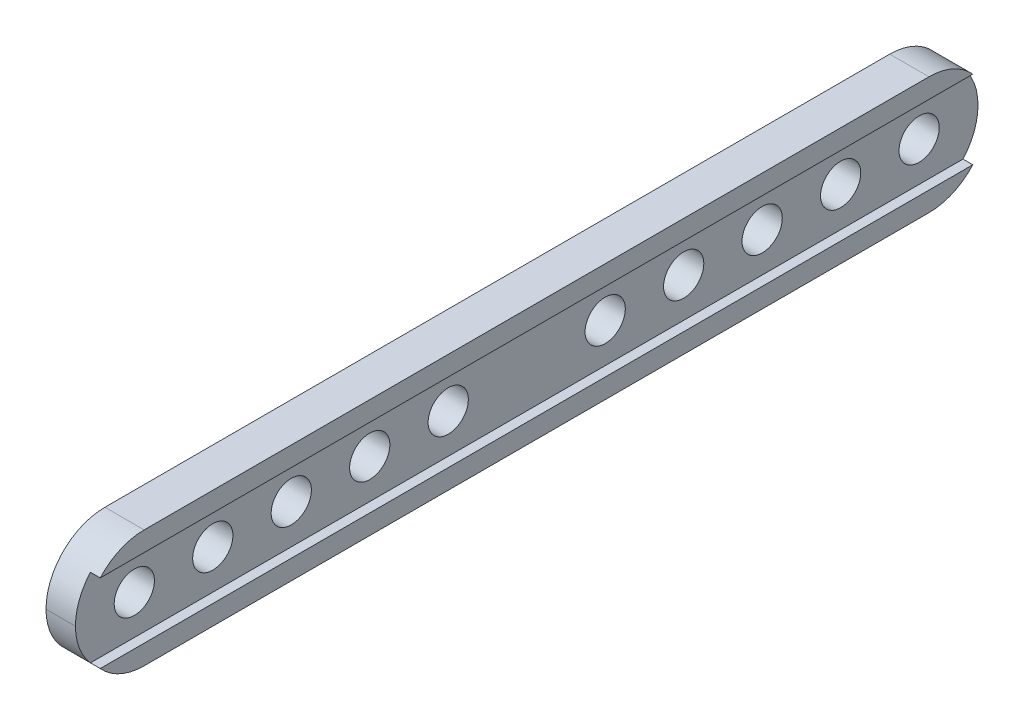
ISO-10303-21;
HEADER;
FILE_DESCRIPTION(('STEP AP214'),'2;1');
FILE_NAME('part.step','',(''),(''),'','','');
FILE_SCHEMA(('AUTOMOTIVE_DESIGN { 1 0 10303 214 1 1 1 1 }'));
ENDSEC;
DATA;
#1=APPLICATION_CONTEXT('core data for automotive mechanical design processes');
#2=APPLICATION_PROTOCOL_DEFINITION('international standard','automotive_design',2000,#1);
#3=PRODUCT_CONTEXT('',#1,'mechanical');
#4=PRODUCT('Part','Part','',(#3));
#5=PRODUCT_RELATED_PRODUCT_CATEGORY('part','',(#4));
#6=PRODUCT_DEFINITION_FORMATION('','',#4);
#7=PRODUCT_DEFINITION_CONTEXT('part definition',#1,'design');
#8=PRODUCT_DEFINITION('design','',#6,#7);
#9=PRODUCT_DEFINITION_SHAPE('','',#8);
#10=(LENGTH_UNIT() NAMED_UNIT(*) SI_UNIT(.MILLI.,.METRE.));
#11=(NAMED_UNIT(*) PLANE_ANGLE_UNIT() SI_UNIT($,.RADIAN.));
#12=(NAMED_UNIT(*) SI_UNIT($,.STERADIAN.) SOLID_ANGLE_UNIT());
#13=UNCERTAINTY_MEASURE_WITH_UNIT(LENGTH_MEASURE(1.E-05),#10,'distance_accuracy_value','');
#14=(GEOMETRIC_REPRESENTATION_CONTEXT(3) GLOBAL_UNCERTAINTY_ASSIGNED_CONTEXT((#13)) GLOBAL_UNIT_ASSIGNED_CONTEXT((#10,
#11,#12)) REPRESENTATION_CONTEXT('',''));
#15=CARTESIAN_POINT('',(0.,0.,0.));
#16=DIRECTION('',(0.,0.,1.));
#17=DIRECTION('',(1.,0.,0.));
#18=AXIS2_PLACEMENT_3D('',#15,#16,#17);
#19=CARTESIAN_POINT('',(4.,6.,-54.));
#20=DIRECTION('',(-1.,0.,0.));
#21=DIRECTION('',(0.,-1.,0.));
#22=AXIS2_PLACEMENT_3D('',#19,#20,#21);
#23=CYLINDRICAL_SURFACE('',#22,2.04999999999999);
#24=CARTESIAN_POINT('',(3.,6.,-54.));
#25=DIRECTION('',(1.,0.,0.));
#26=DIRECTION('',(0.,1.,0.));
#27=AXIS2_PLACEMENT_3D('',#24,#25,#26);
#28=CIRCLE('',#27,2.04999999999999);
#29=CARTESIAN_POINT('',(3.,8.04999999999999,-54.));
#30=VERTEX_POINT('',#29);
#31=EDGE_CURVE('E41',#30,#30,#28,.T.);
#32=ORIENTED_EDGE('',*,*,#31,.T.);
#33=EDGE_LOOP('',(#32));
#34=FACE_BOUND('',#33,.T.);
#35=CARTESIAN_POINT('',(0.,6.,-54.));
#36=DIRECTION('',(-1.,0.,0.));
#37=DIRECTION('',(0.,-1.,0.));
#38=AXIS2_PLACEMENT_3D('',#35,#36,#37);
#39=CIRCLE('',#38,2.04999999999999);
#40=CARTESIAN_POINT('',(0.,3.95000000000001,-54.));
#41=VERTEX_POINT('',#40);
#42=EDGE_CURVE('E11',#41,#41,#39,.T.);
#43=ORIENTED_EDGE('',*,*,#42,.T.);
#44=EDGE_LOOP('',(#43));
#45=FACE_BOUND('',#44,.T.);
#46=ADVANCED_FACE('F33',(#34,#45),#23,.F.);
#47=CARTESIAN_POINT('',(4.,6.,-62.));
#48=DIRECTION('',(-1.,0.,0.));
#49=DIRECTION('',(0.,-1.,0.));
#50=AXIS2_PLACEMENT_3D('',#47,#48,#49);
#51=CYLINDRICAL_SURFACE('',#50,2.04999999999999);
#52=CARTESIAN_POINT('',(3.,6.,-62.));
#53=DIRECTION('',(1.,0.,0.));
#54=DIRECTION('',(0.,1.,0.));
#55=AXIS2_PLACEMENT_3D('',#52,#53,#54);
#56=CIRCLE('',#55,2.04999999999999);
#57=CARTESIAN_POINT('',(3.,8.04999999999999,-62.));
#58=VERTEX_POINT('',#57);
#59=EDGE_CURVE('E185',#58,#58,#56,.T.);
#60=ORIENTED_EDGE('',*,*,#59,.T.);
#61=EDGE_LOOP('',(#60));
#62=FACE_BOUND('',#61,.T.);
#63=CARTESIAN_POINT('',(0.,6.,-62.));
#64=DIRECTION('',(-1.,0.,0.));
#65=DIRECTION('',(0.,-1.,0.));
#66=AXIS2_PLACEMENT_3D('',#63,#64,#65);
#67=CIRCLE('',#66,2.04999999999999);
#68=CARTESIAN_POINT('',(0.,3.95000000000001,-62.));
#69=VERTEX_POINT('',#68);
#70=EDGE_CURVE('E188',#69,#69,#67,.T.);
#71=ORIENTED_EDGE('',*,*,#70,.T.);
#72=EDGE_LOOP('',(#71));
#73=FACE_BOUND('',#72,.T.);
#74=ADVANCED_FACE('F270',(#62,#73),#51,.F.);
#75=CARTESIAN_POINT('',(4.,6.,-70.));
#76=DIRECTION('',(-1.,0.,0.));
#77=DIRECTION('',(0.,-1.,0.));
#78=AXIS2_PLACEMENT_3D('',#75,#76,#77);
#79=CYLINDRICAL_SURFACE('',#78,2.04999999999999);
#80=CARTESIAN_POINT('',(3.,6.,-70.));
#81=DIRECTION('',(1.,0.,0.));
#82=DIRECTION('',(0.,1.,0.));
#83=AXIS2_PLACEMENT_3D('',#80,#81,#82);
#84=CIRCLE('',#83,2.04999999999999);
#85=CARTESIAN_POINT('',(3.,8.04999999999999,-70.));
#86=VERTEX_POINT('',#85);
#87=EDGE_CURVE('E172',#86,#86,#84,.T.);
#88=ORIENTED_EDGE('',*,*,#87,.T.);
#89=EDGE_LOOP('',(#88));
#90=FACE_BOUND('',#89,.T.);
#91=CARTESIAN_POINT('',(0.,6.,-70.));
#92=DIRECTION('',(-1.,0.,0.));
#93=DIRECTION('',(0.,-1.,0.));
#94=AXIS2_PLACEMENT_3D('',#91,#92,#93);
#95=CIRCLE('',#94,2.04999999999999);
#96=CARTESIAN_POINT('',(0.,3.95000000000001,-70.));
#97=VERTEX_POINT('',#96);
#98=EDGE_CURVE('E182',#97,#97,#95,.T.);
#99=ORIENTED_EDGE('',*,*,#98,.T.);
#100=EDGE_LOOP('',(#99));
#101=FACE_BOUND('',#100,.T.);
#102=ADVANCED_FACE('F275',(#90,#101),#79,.F.);
#103=CARTESIAN_POINT('',(0.,0.,-92.));
#104=DIRECTION('',(-1.,0.,0.));
#105=DIRECTION('',(0.,-1.,0.));
#106=AXIS2_PLACEMENT_3D('',#103,#104,#105);
#107=PLANE('',#106);
#108=CARTESIAN_POINT('',(0.,6.,-22.));
#109=DIRECTION('',(1.,0.,0.));
#110=DIRECTION('',(0.,-1.,0.));
#111=AXIS2_PLACEMENT_3D('',#108,#109,#110);
#112=CIRCLE('',#111,2.04999999999999);
#113=CARTESIAN_POINT('',(0.,3.95000000000001,-22.));
#114=VERTEX_POINT('',#113);
#115=EDGE_CURVE('E205',#114,#114,#112,.T.);
#116=ORIENTED_EDGE('',*,*,#115,.T.);
#117=EDGE_LOOP('',(#116));
#118=FACE_BOUND('',#117,.T.);
#119=CARTESIAN_POINT('',(0.,6.,-30.));
#120=DIRECTION('',(1.,0.,0.));
#121=DIRECTION('',(0.,-1.,0.));
#122=AXIS2_PLACEMENT_3D('',#119,#120,#121);
#123=CIRCLE('',#122,2.04999999999999);
#124=CARTESIAN_POINT('',(0.,3.95000000000001,-30.));
#125=VERTEX_POINT('',#124);
#126=EDGE_CURVE('E351',#125,#125,#123,.T.);
#127=ORIENTED_EDGE('',*,*,#126,.T.);
#128=EDGE_LOOP('',(#127));
#129=FACE_BOUND('',#128,.T.);
#130=CARTESIAN_POINT('',(0.,6.,-38.));
#131=DIRECTION('',(1.,0.,0.));
#132=DIRECTION('',(0.,-1.,0.));
#133=AXIS2_PLACEMENT_3D('',#130,#131,#132);
#134=CIRCLE('',#133,2.04999999999999);
#135=CARTESIAN_POINT('',(0.,3.95000000000001,-38.));
#136=VERTEX_POINT('',#135);
#137=EDGE_CURVE('E218',#136,#136,#134,.T.);
#138=ORIENTED_EDGE('',*,*,#137,.T.);
#139=EDGE_LOOP('',(#138));
#140=FACE_BOUND('',#139,.T.);
#141=CARTESIAN_POINT('',(0.,6.,-14.));
#142=DIRECTION('',(1.,0.,0.));
#143=DIRECTION('',(0.,-1.,0.));
#144=AXIS2_PLACEMENT_3D('',#141,#142,#143);
#145=CIRCLE('',#144,2.04999999999999);
#146=CARTESIAN_POINT('',(0.,3.95000000000001,-14.));
#147=VERTEX_POINT('',#146);
#148=EDGE_CURVE('E201',#147,#147,#145,.T.);
#149=ORIENTED_EDGE('',*,*,#148,.T.);
#150=EDGE_LOOP('',(#149));
#151=FACE_BOUND('',#150,.T.);
#152=CARTESIAN_POINT('',(0.,6.,-6.00000000000001));
#153=DIRECTION('',(1.,0.,0.));
#154=DIRECTION('',(0.,-1.,0.));
#155=AXIS2_PLACEMENT_3D('',#152,#153,#154);
#156=CIRCLE('',#155,2.04999999999999);
#157=CARTESIAN_POINT('',(0.,3.95000000000001,-6.00000000000001));
#158=VERTEX_POINT('',#157);
#159=EDGE_CURVE('E197',#158,#158,#156,.T.);
#160=ORIENTED_EDGE('',*,*,#159,.T.);
#161=EDGE_LOOP('',(#160));
#162=FACE_BOUND('',#161,.T.);
#163=CARTESIAN_POINT('',(0.,6.,-78.));
#164=DIRECTION('',(-1.,0.,0.));
#165=DIRECTION('',(0.,-1.,0.));
#166=AXIS2_PLACEMENT_3D('',#163,#164,#165);
#167=CIRCLE('',#166,2.04999999999999);
#168=CARTESIAN_POINT('',(0.,3.95000000000001,-78.));
#169=VERTEX_POINT('',#168);
#170=EDGE_CURVE('E224',#169,#169,#167,.T.);
#171=ORIENTED_EDGE('',*,*,#170,.F.);
#172=EDGE_LOOP('',(#171));
#173=FACE_BOUND('',#172,.T.);
#174=CARTESIAN_POINT('',(0.,6.,-86.));
#175=DIRECTION('',(-1.,0.,0.));
#176=DIRECTION('',(0.,-1.,0.));
#177=AXIS2_PLACEMENT_3D('',#174,#175,#176);
#178=CIRCLE('',#177,2.04999999999999);
#179=CARTESIAN_POINT('',(0.,3.95000000000001,-86.));
#180=VERTEX_POINT('',#179);
#181=EDGE_CURVE('E179',#180,#180,#178,.T.);
#182=ORIENTED_EDGE('',*,*,#181,.F.);
#183=EDGE_LOOP('',(#182));
#184=FACE_BOUND('',#183,.T.);
#185=CARTESIAN_POINT('',(0.,6.,-6.));
#186=DIRECTION('',(-1.,0.,0.));
#187=DIRECTION('',(0.,-1.,0.));
#188=AXIS2_PLACEMENT_3D('',#185,#186,#187);
#189=CIRCLE('',#188,6.);
#190=CARTESIAN_POINT('',(0.,0.,-6.00000000000001));
#191=VERTEX_POINT('',#190);
#192=CARTESIAN_POINT('',(0.,6.,0.));
#193=VERTEX_POINT('',#192);
#194=EDGE_CURVE('E114',#191,#193,#189,.T.);
#195=ORIENTED_EDGE('',*,*,#194,.T.);
#196=CARTESIAN_POINT('',(0.,6.,-6.));
#197=DIRECTION('',(-1.,0.,0.));
#198=DIRECTION('',(0.,-1.,0.));
#199=AXIS2_PLACEMENT_3D('',#196,#197,#198);
#200=CIRCLE('',#199,6.);
#201=CARTESIAN_POINT('',(0.,12.,-6.00000000000001));
#202=VERTEX_POINT('',#201);
#203=EDGE_CURVE('E120',#193,#202,#200,.T.);
#204=ORIENTED_EDGE('',*,*,#203,.T.);
#205=DIRECTION('',(0.,0.,1.));
#206=VECTOR('',#205,1.);
#207=CARTESIAN_POINT('',(0.,12.,-92.));
#208=LINE('',#207,#206);
#209=CARTESIAN_POINT('',(0.,12.,-86.));
#210=VERTEX_POINT('',#209);
#211=EDGE_CURVE('E229',#210,#202,#208,.T.);
#212=ORIENTED_EDGE('',*,*,#211,.F.);
#213=CARTESIAN_POINT('',(0.,6.,-86.));
#214=DIRECTION('',(-1.,0.,0.));
#215=DIRECTION('',(0.,-1.,0.));
#216=AXIS2_PLACEMENT_3D('',#213,#214,#215);
#217=CIRCLE('',#216,6.);
#218=CARTESIAN_POINT('',(0.,6.,-92.));
#219=VERTEX_POINT('',#218);
#220=EDGE_CURVE('E231',#210,#219,#217,.T.);
#221=ORIENTED_EDGE('',*,*,#220,.T.);
#222=CARTESIAN_POINT('',(0.,6.,-86.));
#223=DIRECTION('',(-1.,0.,0.));
#224=DIRECTION('',(0.,-1.,0.));
#225=AXIS2_PLACEMENT_3D('',#222,#223,#224);
#226=CIRCLE('',#225,6.);
#227=CARTESIAN_POINT('',(0.,0.,-86.));
#228=VERTEX_POINT('',#227);
#229=EDGE_CURVE('E126',#219,#228,#226,.T.);
#230=ORIENTED_EDGE('',*,*,#229,.T.);
#231=DIRECTION('',(0.,0.,1.));
#232=VECTOR('',#231,1.);
#233=CARTESIAN_POINT('',(0.,0.,-92.));
#234=LINE('',#233,#232);
#235=EDGE_CURVE('E123',#228,#191,#234,.T.);
#236=ORIENTED_EDGE('',*,*,#235,.T.);
#237=EDGE_LOOP('',(#195,#204,#212,#221,#230,#236));
#238=FACE_BOUND('',#237,.T.);
#239=ORIENTED_EDGE('',*,*,#98,.F.);
#240=EDGE_LOOP('',(#239));
#241=FACE_BOUND('',#240,.T.);
#242=ORIENTED_EDGE('',*,*,#70,.F.);
#243=EDGE_LOOP('',(#242));
#244=FACE_BOUND('',#243,.T.);
#245=ORIENTED_EDGE('',*,*,#42,.F.);
#246=EDGE_LOOP('',(#245));
#247=FACE_BOUND('',#246,.T.);
#248=ADVANCED_FACE('F116',(#118,#129,#140,#151,#162,#173,#184,#238,#241,#244,#247),#107,.T.);
#249=CARTESIAN_POINT('',(0.,12.,-92.));
#250=DIRECTION('',(0.,1.,0.));
#251=DIRECTION('',(0.,0.,1.));
#252=AXIS2_PLACEMENT_3D('',#249,#250,#251);
#253=PLANE('',#252);
#254=ORIENTED_EDGE('',*,*,#211,.T.);
#255=DIRECTION('',(-1.,0.,0.));
#256=VECTOR('',#255,1.);
#257=CARTESIAN_POINT('',(4.,12.,-6.));
#258=LINE('',#257,#256);
#259=CARTESIAN_POINT('',(4.,12.,-6.00000000000001));
#260=VERTEX_POINT('',#259);
#261=EDGE_CURVE('E141',#202,#260,#258,.F.);
#262=ORIENTED_EDGE('',*,*,#261,.T.);
#263=DIRECTION('',(0.,0.,1.));
#264=VECTOR('',#263,1.);
#265=CARTESIAN_POINT('',(4.,12.,-92.));
#266=LINE('',#265,#264);
#267=CARTESIAN_POINT('',(4.,12.,-86.));
#268=VERTEX_POINT('',#267);
#269=EDGE_CURVE('E232',#268,#260,#266,.T.);
#270=ORIENTED_EDGE('',*,*,#269,.F.);
#271=DIRECTION('',(-1.,0.,0.));
#272=VECTOR('',#271,1.);
#273=CARTESIAN_POINT('',(0.,12.,-86.));
#274=LINE('',#273,#272);
#275=EDGE_CURVE('E142',#268,#210,#274,.T.);
#276=ORIENTED_EDGE('',*,*,#275,.T.);
#277=EDGE_LOOP('',(#254,#262,#270,#276));
#278=FACE_BOUND('',#277,.T.);
#279=ADVANCED_FACE('F282',(#278),#253,.T.);
#280=CARTESIAN_POINT('',(4.,10.,-92.));
#281=DIRECTION('',(1.,0.,0.));
#282=DIRECTION('',(0.,1.,0.));
#283=AXIS2_PLACEMENT_3D('',#280,#281,#282);
#284=PLANE('',#283);
#285=ORIENTED_EDGE('',*,*,#269,.T.);
#286=CARTESIAN_POINT('',(4.,6.,-6.));
#287=DIRECTION('',(1.,0.,0.));
#288=DIRECTION('',(0.,1.,0.));
#289=AXIS2_PLACEMENT_3D('',#286,#287,#288);
#290=CIRCLE('',#289,6.);
#291=CARTESIAN_POINT('',(4.,10.,-1.52786404500042));
#292=VERTEX_POINT('',#291);
#293=EDGE_CURVE('E150',#260,#292,#290,.T.);
#294=ORIENTED_EDGE('',*,*,#293,.T.);
#295=DIRECTION('',(0.,0.,1.));
#296=VECTOR('',#295,1.);
#297=CARTESIAN_POINT('',(4.,10.,-92.));
#298=LINE('',#297,#296);
#299=CARTESIAN_POINT('',(4.,10.,-90.4721359549996));
#300=VERTEX_POINT('',#299);
#301=EDGE_CURVE('E235',#300,#292,#298,.T.);
#302=ORIENTED_EDGE('',*,*,#301,.F.);
#303=CARTESIAN_POINT('',(4.,6.,-86.));
#304=DIRECTION('',(1.,0.,0.));
#305=DIRECTION('',(0.,1.,0.));
#306=AXIS2_PLACEMENT_3D('',#303,#304,#305);
#307=CIRCLE('',#306,6.);
#308=EDGE_CURVE('E148',#300,#268,#307,.T.);
#309=ORIENTED_EDGE('',*,*,#308,.T.);
#310=EDGE_LOOP('',(#285,#294,#302,#309));
#311=FACE_BOUND('',#310,.T.);
#312=ADVANCED_FACE('F289',(#311),#284,.T.);
#313=CARTESIAN_POINT('',(4.,10.,-92.));
#314=DIRECTION('',(0.,-1.,0.));
#315=DIRECTION('',(1.,0.,0.));
#316=AXIS2_PLACEMENT_3D('',#313,#314,#315);
#317=PLANE('',#316);
#318=ORIENTED_EDGE('',*,*,#301,.T.);
#319=DIRECTION('',(1.,0.,0.));
#320=VECTOR('',#319,1.);
#321=CARTESIAN_POINT('',(4.,10.,-1.52786404500043));
#322=LINE('',#321,#320);
#323=CARTESIAN_POINT('',(3.,10.,-1.52786404500042));
#324=VERTEX_POINT('',#323);
#325=EDGE_CURVE('E154',#292,#324,#322,.F.);
#326=ORIENTED_EDGE('',*,*,#325,.T.);
#327=DIRECTION('',(0.,0.,1.));
#328=VECTOR('',#327,1.);
#329=CARTESIAN_POINT('',(3.,10.,-92.));
#330=LINE('',#329,#328);
#331=CARTESIAN_POINT('',(3.,10.,-90.4721359549996));
#332=VERTEX_POINT('',#331);
#333=EDGE_CURVE('E238',#332,#324,#330,.T.);
#334=ORIENTED_EDGE('',*,*,#333,.F.);
#335=DIRECTION('',(-1.,0.,0.));
#336=VECTOR('',#335,1.);
#337=CARTESIAN_POINT('',(3.,10.,-90.4721359549996));
#338=LINE('',#337,#336);
#339=EDGE_CURVE('E152',#332,#300,#338,.F.);
#340=ORIENTED_EDGE('',*,*,#339,.T.);
#341=EDGE_LOOP('',(#318,#326,#334,#340));
#342=FACE_BOUND('',#341,.T.);
#343=ADVANCED_FACE('F318',(#342),#317,.T.);
#344=CARTESIAN_POINT('',(3.,10.,-92.));
#345=DIRECTION('',(1.,0.,0.));
#346=DIRECTION('',(0.,1.,0.));
#347=AXIS2_PLACEMENT_3D('',#344,#345,#346);
#348=PLANE('',#347);
#349=CARTESIAN_POINT('',(3.,6.,-22.));
#350=DIRECTION('',(1.,0.,0.));
#351=DIRECTION('',(0.,1.,0.));
#352=AXIS2_PLACEMENT_3D('',#349,#350,#351);
#353=CIRCLE('',#352,2.04999999999999);
#354=CARTESIAN_POINT('',(3.,8.04999999999999,-22.));
#355=VERTEX_POINT('',#354);
#356=EDGE_CURVE('E36',#355,#355,#353,.F.);
#357=ORIENTED_EDGE('',*,*,#356,.T.);
#358=EDGE_LOOP('',(#357));
#359=FACE_BOUND('',#358,.T.);
#360=CARTESIAN_POINT('',(3.,6.,-30.));
#361=DIRECTION('',(1.,0.,0.));
#362=DIRECTION('',(0.,1.,0.));
#363=AXIS2_PLACEMENT_3D('',#360,#361,#362);
#364=CIRCLE('',#363,2.04999999999999);
#365=CARTESIAN_POINT('',(3.,8.04999999999999,-30.));
#366=VERTEX_POINT('',#365);
#367=EDGE_CURVE('E204',#366,#366,#364,.F.);
#368=ORIENTED_EDGE('',*,*,#367,.T.);
#369=EDGE_LOOP('',(#368));
#370=FACE_BOUND('',#369,.T.);
#371=CARTESIAN_POINT('',(3.,6.,-38.));
#372=DIRECTION('',(1.,0.,0.));
#373=DIRECTION('',(0.,1.,0.));
#374=AXIS2_PLACEMENT_3D('',#371,#372,#373);
#375=CIRCLE('',#374,2.04999999999999);
#376=CARTESIAN_POINT('',(3.,8.04999999999999,-38.));
#377=VERTEX_POINT('',#376);
#378=EDGE_CURVE('E202',#377,#377,#375,.F.);
#379=ORIENTED_EDGE('',*,*,#378,.T.);
#380=EDGE_LOOP('',(#379));
#381=FACE_BOUND('',#380,.T.);
#382=CARTESIAN_POINT('',(3.,6.,-14.));
#383=DIRECTION('',(1.,0.,0.));
#384=DIRECTION('',(0.,1.,0.));
#385=AXIS2_PLACEMENT_3D('',#382,#383,#384);
#386=CIRCLE('',#385,2.04999999999999);
#387=CARTESIAN_POINT('',(3.,8.04999999999999,-14.));
#388=VERTEX_POINT('',#387);
#389=EDGE_CURVE('E198',#388,#388,#386,.F.);
#390=ORIENTED_EDGE('',*,*,#389,.T.);
#391=EDGE_LOOP('',(#390));
#392=FACE_BOUND('',#391,.T.);
#393=CARTESIAN_POINT('',(3.,6.,-6.00000000000001));
#394=DIRECTION('',(1.,0.,0.));
#395=DIRECTION('',(0.,1.,0.));
#396=AXIS2_PLACEMENT_3D('',#393,#394,#395);
#397=CIRCLE('',#396,2.04999999999999);
#398=CARTESIAN_POINT('',(3.,8.04999999999999,-6.00000000000001));
#399=VERTEX_POINT('',#398);
#400=EDGE_CURVE('E193',#399,#399,#397,.F.);
#401=ORIENTED_EDGE('',*,*,#400,.T.);
#402=EDGE_LOOP('',(#401));
#403=FACE_BOUND('',#402,.T.);
#404=CARTESIAN_POINT('',(3.,6.,-78.));
#405=DIRECTION('',(1.,0.,0.));
#406=DIRECTION('',(0.,1.,0.));
#407=AXIS2_PLACEMENT_3D('',#404,#405,#406);
#408=CIRCLE('',#407,2.04999999999999);
#409=CARTESIAN_POINT('',(3.,8.04999999999999,-78.));
#410=VERTEX_POINT('',#409);
#411=EDGE_CURVE('E196',#410,#410,#408,.T.);
#412=ORIENTED_EDGE('',*,*,#411,.F.);
#413=EDGE_LOOP('',(#412));
#414=FACE_BOUND('',#413,.T.);
#415=CARTESIAN_POINT('',(3.,6.,-86.));
#416=DIRECTION('',(1.,0.,0.));
#417=DIRECTION('',(0.,1.,0.));
#418=AXIS2_PLACEMENT_3D('',#415,#416,#417);
#419=CIRCLE('',#418,2.04999999999999);
#420=CARTESIAN_POINT('',(3.,8.04999999999999,-86.));
#421=VERTEX_POINT('',#420);
#422=EDGE_CURVE('E176',#421,#421,#419,.T.);
#423=ORIENTED_EDGE('',*,*,#422,.F.);
#424=EDGE_LOOP('',(#423));
#425=FACE_BOUND('',#424,.T.);
#426=ORIENTED_EDGE('',*,*,#333,.T.);
#427=CARTESIAN_POINT('',(3.,6.,-6.));
#428=DIRECTION('',(1.,0.,0.));
#429=DIRECTION('',(0.,1.,0.));
#430=AXIS2_PLACEMENT_3D('',#427,#428,#429);
#431=CIRCLE('',#430,6.);
#432=CARTESIAN_POINT('',(3.,6.,0.));
#433=VERTEX_POINT('',#432);
#434=EDGE_CURVE('E161',#324,#433,#431,.T.);
#435=ORIENTED_EDGE('',*,*,#434,.T.);
#436=CARTESIAN_POINT('',(3.,6.,-6.));
#437=DIRECTION('',(1.,0.,0.));
#438=DIRECTION('',(0.,1.,0.));
#439=AXIS2_PLACEMENT_3D('',#436,#437,#438);
#440=CIRCLE('',#439,6.);
#441=CARTESIAN_POINT('',(3.,2.,-1.52786404500042));
#442=VERTEX_POINT('',#441);
#443=EDGE_CURVE('E133',#433,#442,#440,.T.);
#444=ORIENTED_EDGE('',*,*,#443,.T.);
#445=DIRECTION('',(0.,0.,1.));
#446=VECTOR('',#445,1.);
#447=CARTESIAN_POINT('',(3.,2.,-92.));
#448=LINE('',#447,#446);
#449=CARTESIAN_POINT('',(3.,2.,-90.4721359549996));
#450=VERTEX_POINT('',#449);
#451=EDGE_CURVE('E241',#450,#442,#448,.T.);
#452=ORIENTED_EDGE('',*,*,#451,.F.);
#453=CARTESIAN_POINT('',(3.,6.,-86.));
#454=DIRECTION('',(1.,0.,0.));
#455=DIRECTION('',(0.,1.,0.));
#456=AXIS2_PLACEMENT_3D('',#453,#454,#455);
#457=CIRCLE('',#456,6.);
#458=CARTESIAN_POINT('',(3.,6.,-92.));
#459=VERTEX_POINT('',#458);
#460=EDGE_CURVE('E158',#450,#459,#457,.T.);
#461=ORIENTED_EDGE('',*,*,#460,.T.);
#462=CARTESIAN_POINT('',(3.,6.,-86.));
#463=DIRECTION('',(1.,0.,0.));
#464=DIRECTION('',(0.,1.,0.));
#465=AXIS2_PLACEMENT_3D('',#462,#463,#464);
#466=CIRCLE('',#465,6.);
#467=EDGE_CURVE('E156',#459,#332,#466,.T.);
#468=ORIENTED_EDGE('',*,*,#467,.T.);
#469=EDGE_LOOP('',(#426,#435,#444,#452,#461,#468));
#470=FACE_BOUND('',#469,.T.);
#471=ORIENTED_EDGE('',*,*,#87,.F.);
#472=EDGE_LOOP('',(#471));
#473=FACE_BOUND('',#472,.T.);
#474=ORIENTED_EDGE('',*,*,#59,.F.);
#475=EDGE_LOOP('',(#474));
#476=FACE_BOUND('',#475,.T.);
#477=ORIENTED_EDGE('',*,*,#31,.F.);
#478=EDGE_LOOP('',(#477));
#479=FACE_BOUND('',#478,.T.);
#480=ADVANCED_FACE('F312',(#359,#370,#381,#392,#403,#414,#425,#470,#473,#476,#479),#348,.T.);
#481=CARTESIAN_POINT('',(4.,2.,-92.));
#482=DIRECTION('',(0.,1.,0.));
#483=DIRECTION('',(-1.,0.,0.));
#484=AXIS2_PLACEMENT_3D('',#481,#482,#483);
#485=PLANE('',#484);
#486=ORIENTED_EDGE('',*,*,#451,.T.);
#487=DIRECTION('',(-1.,0.,0.));
#488=VECTOR('',#487,1.);
#489=CARTESIAN_POINT('',(3.,2.,-1.52786404500043));
#490=LINE('',#489,#488);
#491=CARTESIAN_POINT('',(4.,2.,-1.52786404500042));
#492=VERTEX_POINT('',#491);
#493=EDGE_CURVE('E165',#442,#492,#490,.F.);
#494=ORIENTED_EDGE('',*,*,#493,.T.);
#495=DIRECTION('',(0.,0.,1.));
#496=VECTOR('',#495,1.);
#497=CARTESIAN_POINT('',(4.,2.,-92.));
#498=LINE('',#497,#496);
#499=CARTESIAN_POINT('',(4.,2.,-90.4721359549996));
#500=VERTEX_POINT('',#499);
#501=EDGE_CURVE('E244',#500,#492,#498,.T.);
#502=ORIENTED_EDGE('',*,*,#501,.F.);
#503=DIRECTION('',(1.,0.,0.));
#504=VECTOR('',#503,1.);
#505=CARTESIAN_POINT('',(4.,2.,-90.4721359549996));
#506=LINE('',#505,#504);
#507=EDGE_CURVE('E163',#500,#450,#506,.F.);
#508=ORIENTED_EDGE('',*,*,#507,.T.);
#509=EDGE_LOOP('',(#486,#494,#502,#508));
#510=FACE_BOUND('',#509,.T.);
#511=ADVANCED_FACE('F308',(#510),#485,.T.);
#512=CARTESIAN_POINT('',(4.,0.,-92.));
#513=DIRECTION('',(1.,0.,0.));
#514=DIRECTION('',(0.,1.,0.));
#515=AXIS2_PLACEMENT_3D('',#512,#513,#514);
#516=PLANE('',#515);
#517=ORIENTED_EDGE('',*,*,#501,.T.);
#518=CARTESIAN_POINT('',(4.,6.,-6.));
#519=DIRECTION('',(1.,0.,0.));
#520=DIRECTION('',(0.,1.,0.));
#521=AXIS2_PLACEMENT_3D('',#518,#519,#520);
#522=CIRCLE('',#521,6.);
#523=CARTESIAN_POINT('',(4.,0.,-6.00000000000001));
#524=VERTEX_POINT('',#523);
#525=EDGE_CURVE('E49',#492,#524,#522,.T.);
#526=ORIENTED_EDGE('',*,*,#525,.T.);
#527=DIRECTION('',(0.,0.,1.));
#528=VECTOR('',#527,1.);
#529=CARTESIAN_POINT('',(4.,0.,-92.));
#530=LINE('',#529,#528);
#531=CARTESIAN_POINT('',(4.,0.,-86.));
#532=VERTEX_POINT('',#531);
#533=EDGE_CURVE('E246',#532,#524,#530,.T.);
#534=ORIENTED_EDGE('',*,*,#533,.F.);
#535=CARTESIAN_POINT('',(4.,6.,-86.));
#536=DIRECTION('',(1.,0.,0.));
#537=DIRECTION('',(0.,1.,0.));
#538=AXIS2_PLACEMENT_3D('',#535,#536,#537);
#539=CIRCLE('',#538,6.);
#540=EDGE_CURVE('E57',#532,#500,#539,.T.);
#541=ORIENTED_EDGE('',*,*,#540,.T.);
#542=EDGE_LOOP('',(#517,#526,#534,#541));
#543=FACE_BOUND('',#542,.T.);
#544=ADVANCED_FACE('F304',(#543),#516,.T.);
#545=CARTESIAN_POINT('',(0.,0.,-92.));
#546=DIRECTION('',(0.,-1.,0.));
#547=DIRECTION('',(0.,0.,-1.));
#548=AXIS2_PLACEMENT_3D('',#545,#546,#547);
#549=PLANE('',#548);
#550=ORIENTED_EDGE('',*,*,#533,.T.);
#551=DIRECTION('',(1.,0.,0.));
#552=VECTOR('',#551,1.);
#553=CARTESIAN_POINT('',(0.,0.,-6.));
#554=LINE('',#553,#552);
#555=EDGE_CURVE('E171',#524,#191,#554,.F.);
#556=ORIENTED_EDGE('',*,*,#555,.T.);
#557=ORIENTED_EDGE('',*,*,#235,.F.);
#558=DIRECTION('',(1.,0.,0.));
#559=VECTOR('',#558,1.);
#560=CARTESIAN_POINT('',(0.,0.,-86.));
#561=LINE('',#560,#559);
#562=EDGE_CURVE('E169',#228,#532,#561,.T.);
#563=ORIENTED_EDGE('',*,*,#562,.T.);
#564=EDGE_LOOP('',(#550,#556,#557,#563));
#565=FACE_BOUND('',#564,.T.);
#566=ADVANCED_FACE('F253',(#565),#549,.T.);
#567=CARTESIAN_POINT('',(0.,6.,-6.));
#568=DIRECTION('',(-1.,0.,0.));
#569=DIRECTION('',(0.,0.,1.));
#570=AXIS2_PLACEMENT_3D('',#567,#568,#569);
#571=CYLINDRICAL_SURFACE('',#570,6.);
#572=ORIENTED_EDGE('',*,*,#493,.F.);
#573=ORIENTED_EDGE('',*,*,#443,.F.);
#574=DIRECTION('',(1.,0.,0.));
#575=VECTOR('',#574,1.);
#576=CARTESIAN_POINT('',(4.,6.,0.));
#577=LINE('',#576,#575);
#578=EDGE_CURVE('E130',#193,#433,#577,.T.);
#579=ORIENTED_EDGE('',*,*,#578,.F.);
#580=ORIENTED_EDGE('',*,*,#194,.F.);
#581=ORIENTED_EDGE('',*,*,#555,.F.);
#582=ORIENTED_EDGE('',*,*,#525,.F.);
#583=EDGE_LOOP('',(#572,#573,#579,#580,#581,#582));
#584=FACE_BOUND('',#583,.T.);
#585=ADVANCED_FACE('F132',(#584),#571,.T.);
#586=CARTESIAN_POINT('',(0.,6.,-6.));
#587=DIRECTION('',(1.,0.,0.));
#588=DIRECTION('',(0.,0.,-1.));
#589=AXIS2_PLACEMENT_3D('',#586,#587,#588);
#590=CYLINDRICAL_SURFACE('',#589,6.);
#591=ORIENTED_EDGE('',*,*,#293,.F.);
#592=ORIENTED_EDGE('',*,*,#261,.F.);
#593=ORIENTED_EDGE('',*,*,#203,.F.);
#594=ORIENTED_EDGE('',*,*,#578,.T.);
#595=ORIENTED_EDGE('',*,*,#434,.F.);
#596=ORIENTED_EDGE('',*,*,#325,.F.);
#597=EDGE_LOOP('',(#591,#592,#593,#594,#595,#596));
#598=FACE_BOUND('',#597,.T.);
#599=ADVANCED_FACE('F139',(#598),#590,.T.);
#600=CARTESIAN_POINT('',(0.,6.,-86.));
#601=DIRECTION('',(-1.,0.,0.));
#602=DIRECTION('',(0.,0.,1.));
#603=AXIS2_PLACEMENT_3D('',#600,#601,#602);
#604=CYLINDRICAL_SURFACE('',#603,6.);
#605=DIRECTION('',(-1.,0.,0.));
#606=VECTOR('',#605,1.);
#607=CARTESIAN_POINT('',(0.,6.,-92.));
#608=LINE('',#607,#606);
#609=EDGE_CURVE('E136',#219,#459,#608,.F.);
#610=ORIENTED_EDGE('',*,*,#609,.F.);
#611=ORIENTED_EDGE('',*,*,#220,.F.);
#612=ORIENTED_EDGE('',*,*,#275,.F.);
#613=ORIENTED_EDGE('',*,*,#308,.F.);
#614=ORIENTED_EDGE('',*,*,#339,.F.);
#615=ORIENTED_EDGE('',*,*,#467,.F.);
#616=EDGE_LOOP('',(#610,#611,#612,#613,#614,#615));
#617=FACE_BOUND('',#616,.T.);
#618=ADVANCED_FACE('F257',(#617),#604,.T.);
#619=CARTESIAN_POINT('',(0.,6.,-86.));
#620=DIRECTION('',(1.,0.,0.));
#621=DIRECTION('',(0.,0.,-1.));
#622=AXIS2_PLACEMENT_3D('',#619,#620,#621);
#623=CYLINDRICAL_SURFACE('',#622,6.);
#624=ORIENTED_EDGE('',*,*,#229,.F.);
#625=ORIENTED_EDGE('',*,*,#609,.T.);
#626=ORIENTED_EDGE('',*,*,#460,.F.);
#627=ORIENTED_EDGE('',*,*,#507,.F.);
#628=ORIENTED_EDGE('',*,*,#540,.F.);
#629=ORIENTED_EDGE('',*,*,#562,.F.);
#630=EDGE_LOOP('',(#624,#625,#626,#627,#628,#629));
#631=FACE_BOUND('',#630,.T.);
#632=ADVANCED_FACE('F254',(#631),#623,.T.);
#633=CARTESIAN_POINT('',(4.,6.,-86.));
#634=DIRECTION('',(-1.,0.,0.));
#635=DIRECTION('',(0.,-1.,0.));
#636=AXIS2_PLACEMENT_3D('',#633,#634,#635);
#637=CYLINDRICAL_SURFACE('',#636,2.04999999999999);
#638=ORIENTED_EDGE('',*,*,#422,.T.);
#639=EDGE_LOOP('',(#638));
#640=FACE_BOUND('',#639,.T.);
#641=ORIENTED_EDGE('',*,*,#181,.T.);
#642=EDGE_LOOP('',(#641));
#643=FACE_BOUND('',#642,.T.);
#644=ADVANCED_FACE('F256',(#640,#643),#637,.F.);
#645=CARTESIAN_POINT('',(4.,6.,-78.));
#646=DIRECTION('',(-1.,0.,0.));
#647=DIRECTION('',(0.,-1.,0.));
#648=AXIS2_PLACEMENT_3D('',#645,#646,#647);
#649=CYLINDRICAL_SURFACE('',#648,2.04999999999999);
#650=ORIENTED_EDGE('',*,*,#411,.T.);
#651=EDGE_LOOP('',(#650));
#652=FACE_BOUND('',#651,.T.);
#653=ORIENTED_EDGE('',*,*,#170,.T.);
#654=EDGE_LOOP('',(#653));
#655=FACE_BOUND('',#654,.T.);
#656=ADVANCED_FACE('F263',(#652,#655),#649,.F.);
#657=CARTESIAN_POINT('',(4.,6.,-6.00000000000001));
#658=DIRECTION('',(-1.,0.,0.));
#659=DIRECTION('',(0.,-1.,0.));
#660=AXIS2_PLACEMENT_3D('',#657,#658,#659);
#661=CYLINDRICAL_SURFACE('',#660,2.04999999999999);
#662=ORIENTED_EDGE('',*,*,#400,.F.);
#663=EDGE_LOOP('',(#662));
#664=FACE_BOUND('',#663,.T.);
#665=ORIENTED_EDGE('',*,*,#159,.F.);
#666=EDGE_LOOP('',(#665));
#667=FACE_BOUND('',#666,.T.);
#668=ADVANCED_FACE('F327',(#664,#667),#661,.F.);
#669=CARTESIAN_POINT('',(4.,6.,-14.));
#670=DIRECTION('',(-1.,0.,0.));
#671=DIRECTION('',(0.,-1.,0.));
#672=AXIS2_PLACEMENT_3D('',#669,#670,#671);
#673=CYLINDRICAL_SURFACE('',#672,2.04999999999999);
#674=ORIENTED_EDGE('',*,*,#389,.F.);
#675=EDGE_LOOP('',(#674));
#676=FACE_BOUND('',#675,.T.);
#677=ORIENTED_EDGE('',*,*,#148,.F.);
#678=EDGE_LOOP('',(#677));
#679=FACE_BOUND('',#678,.T.);
#680=ADVANCED_FACE('F331',(#676,#679),#673,.F.);
#681=CARTESIAN_POINT('',(4.,6.,-38.));
#682=DIRECTION('',(-1.,0.,0.));
#683=DIRECTION('',(0.,-1.,0.));
#684=AXIS2_PLACEMENT_3D('',#681,#682,#683);
#685=CYLINDRICAL_SURFACE('',#684,2.04999999999999);
#686=ORIENTED_EDGE('',*,*,#378,.F.);
#687=EDGE_LOOP('',(#686));
#688=FACE_BOUND('',#687,.T.);
#689=ORIENTED_EDGE('',*,*,#137,.F.);
#690=EDGE_LOOP('',(#689));
#691=FACE_BOUND('',#690,.T.);
#692=ADVANCED_FACE('F335',(#688,#691),#685,.F.);
#693=CARTESIAN_POINT('',(4.,6.,-30.));
#694=DIRECTION('',(-1.,0.,0.));
#695=DIRECTION('',(0.,-1.,0.));
#696=AXIS2_PLACEMENT_3D('',#693,#694,#695);
#697=CYLINDRICAL_SURFACE('',#696,2.04999999999999);
#698=ORIENTED_EDGE('',*,*,#367,.F.);
#699=EDGE_LOOP('',(#698));
#700=FACE_BOUND('',#699,.T.);
#701=ORIENTED_EDGE('',*,*,#126,.F.);
#702=EDGE_LOOP('',(#701));
#703=FACE_BOUND('',#702,.T.);
#704=ADVANCED_FACE('F339',(#700,#703),#697,.F.);
#705=CARTESIAN_POINT('',(4.,6.,-22.));
#706=DIRECTION('',(-1.,0.,0.));
#707=DIRECTION('',(0.,-1.,0.));
#708=AXIS2_PLACEMENT_3D('',#705,#706,#707);
#709=CYLINDRICAL_SURFACE('',#708,2.04999999999999);
#710=ORIENTED_EDGE('',*,*,#356,.F.);
#711=EDGE_LOOP('',(#710));
#712=FACE_BOUND('',#711,.T.);
#713=ORIENTED_EDGE('',*,*,#115,.F.);
#714=EDGE_LOOP('',(#713));
#715=FACE_BOUND('',#714,.T.);
#716=ADVANCED_FACE('F343',(#712,#715),#709,.F.);
#717=CLOSED_SHELL('',(#46,#74,#102,#248,#279,#312,#343,#480,#511,#544,#566,#585,#599,#618,#632,
#644,#656,#668,#680,#692,#704,#716));
#718=MANIFOLD_SOLID_BREP('B2',#717);
#719=ADVANCED_BREP_SHAPE_REPRESENTATION('',(#18,#718),#14);
#720=SHAPE_DEFINITION_REPRESENTATION(#9,#719);
ENDSEC;
END-ISO-10303-21;
